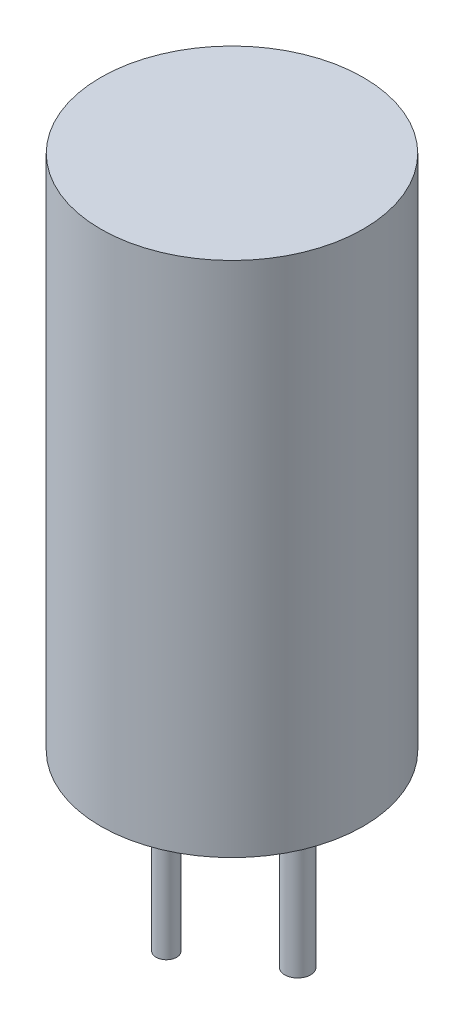
ISO-10303-21;
HEADER;
FILE_DESCRIPTION(('STEP AP214'),'2;1');
FILE_NAME('part.step','',(''),(''),'','','');
FILE_SCHEMA(('AUTOMOTIVE_DESIGN { 1 0 10303 214 1 1 1 1 }'));
ENDSEC;
DATA;
#1=APPLICATION_CONTEXT('core data for automotive mechanical design processes');
#2=APPLICATION_PROTOCOL_DEFINITION('international standard','automotive_design',2000,#1);
#3=PRODUCT_CONTEXT('',#1,'mechanical');
#4=PRODUCT('Part','Part','',(#3));
#5=PRODUCT_RELATED_PRODUCT_CATEGORY('part','',(#4));
#6=PRODUCT_DEFINITION_FORMATION('','',#4);
#7=PRODUCT_DEFINITION_CONTEXT('part definition',#1,'design');
#8=PRODUCT_DEFINITION('design','',#6,#7);
#9=PRODUCT_DEFINITION_SHAPE('','',#8);
#10=(LENGTH_UNIT() NAMED_UNIT(*) SI_UNIT(.MILLI.,.METRE.));
#11=(NAMED_UNIT(*) PLANE_ANGLE_UNIT() SI_UNIT($,.RADIAN.));
#12=(NAMED_UNIT(*) SI_UNIT($,.STERADIAN.) SOLID_ANGLE_UNIT());
#13=UNCERTAINTY_MEASURE_WITH_UNIT(LENGTH_MEASURE(1.E-05),#10,'distance_accuracy_value','');
#14=(GEOMETRIC_REPRESENTATION_CONTEXT(3) GLOBAL_UNCERTAINTY_ASSIGNED_CONTEXT((#13)) GLOBAL_UNIT_ASSIGNED_CONTEXT((#10,
#11,#12)) REPRESENTATION_CONTEXT('',''));
#15=CARTESIAN_POINT('',(0.,0.,0.));
#16=DIRECTION('',(0.,0.,1.));
#17=DIRECTION('',(1.,0.,0.));
#18=AXIS2_PLACEMENT_3D('',#15,#16,#17);
#19=CARTESIAN_POINT('',(0.,0.,0.));
#20=DIRECTION('',(0.,1.,0.));
#21=DIRECTION('',(0.,0.,1.));
#22=AXIS2_PLACEMENT_3D('',#19,#20,#21);
#23=PLANE('',#22);
#24=CARTESIAN_POINT('',(-2.54,0.,0.));
#25=DIRECTION('',(0.,1.,0.));
#26=DIRECTION('',(0.,0.,1.));
#27=AXIS2_PLACEMENT_3D('',#24,#25,#26);
#28=CIRCLE('',#27,0.4);
#29=CARTESIAN_POINT('',(-2.54,0.,0.4));
#30=VERTEX_POINT('',#29);
#31=EDGE_CURVE('E38',#30,#30,#28,.F.);
#32=ORIENTED_EDGE('',*,*,#31,.F.);
#33=EDGE_LOOP('',(#32));
#34=FACE_BOUND('',#33,.T.);
#35=CARTESIAN_POINT('',(0.,0.,0.));
#36=DIRECTION('',(0.,1.,0.));
#37=DIRECTION('',(0.,0.,1.));
#38=AXIS2_PLACEMENT_3D('',#35,#36,#37);
#39=CIRCLE('',#38,5.08);
#40=CARTESIAN_POINT('',(0.,0.,5.08));
#41=VERTEX_POINT('',#40);
#42=EDGE_CURVE('E46',#41,#41,#39,.T.);
#43=ORIENTED_EDGE('',*,*,#42,.F.);
#44=EDGE_LOOP('',(#43));
#45=FACE_BOUND('',#44,.T.);
#46=CARTESIAN_POINT('',(2.54,0.,0.));
#47=DIRECTION('',(0.,1.,0.));
#48=DIRECTION('',(0.,0.,1.));
#49=AXIS2_PLACEMENT_3D('',#46,#47,#48);
#50=CIRCLE('',#49,0.500000000000001);
#51=CARTESIAN_POINT('',(2.54,0.,0.5));
#52=VERTEX_POINT('',#51);
#53=EDGE_CURVE('E10',#52,#52,#50,.F.);
#54=ORIENTED_EDGE('',*,*,#53,.F.);
#55=EDGE_LOOP('',(#54));
#56=FACE_BOUND('',#55,.T.);
#57=ADVANCED_FACE('F31',(#34,#45,#56),#23,.F.);
#58=CARTESIAN_POINT('',(0.,20.,0.));
#59=DIRECTION('',(0.,-1.,0.));
#60=DIRECTION('',(0.,0.,-1.));
#61=AXIS2_PLACEMENT_3D('',#58,#59,#60);
#62=CYLINDRICAL_SURFACE('',#61,5.08);
#63=CARTESIAN_POINT('',(0.,20.,0.));
#64=DIRECTION('',(0.,1.,0.));
#65=DIRECTION('',(0.,0.,1.));
#66=AXIS2_PLACEMENT_3D('',#63,#64,#65);
#67=CIRCLE('',#66,5.08);
#68=CARTESIAN_POINT('',(0.,20.,5.08));
#69=VERTEX_POINT('',#68);
#70=EDGE_CURVE('E42',#69,#69,#67,.T.);
#71=ORIENTED_EDGE('',*,*,#70,.F.);
#72=EDGE_LOOP('',(#71));
#73=FACE_BOUND('',#72,.T.);
#74=ORIENTED_EDGE('',*,*,#42,.T.);
#75=EDGE_LOOP('',(#74));
#76=FACE_BOUND('',#75,.T.);
#77=ADVANCED_FACE('F33',(#73,#76),#62,.T.);
#78=CARTESIAN_POINT('',(0.,20.,0.));
#79=DIRECTION('',(0.,1.,0.));
#80=DIRECTION('',(0.,0.,1.));
#81=AXIS2_PLACEMENT_3D('',#78,#79,#80);
#82=PLANE('',#81);
#83=ORIENTED_EDGE('',*,*,#70,.T.);
#84=EDGE_LOOP('',(#83));
#85=FACE_BOUND('',#84,.T.);
#86=ADVANCED_FACE('F77',(#85),#82,.T.);
#87=CARTESIAN_POINT('',(-2.54,-8.,0.));
#88=DIRECTION('',(0.,1.,0.));
#89=DIRECTION('',(0.,0.,1.));
#90=AXIS2_PLACEMENT_3D('',#87,#88,#89);
#91=CYLINDRICAL_SURFACE('',#90,0.4);
#92=CARTESIAN_POINT('',(-2.54,-8.,0.));
#93=DIRECTION('',(0.,-1.,0.));
#94=DIRECTION('',(0.,0.,-1.));
#95=AXIS2_PLACEMENT_3D('',#92,#93,#94);
#96=CIRCLE('',#95,0.4);
#97=CARTESIAN_POINT('',(-2.54,-8.,-0.4));
#98=VERTEX_POINT('',#97);
#99=EDGE_CURVE('E50',#98,#98,#96,.T.);
#100=ORIENTED_EDGE('',*,*,#99,.F.);
#101=EDGE_LOOP('',(#100));
#102=FACE_BOUND('',#101,.T.);
#103=ORIENTED_EDGE('',*,*,#31,.T.);
#104=EDGE_LOOP('',(#103));
#105=FACE_BOUND('',#104,.T.);
#106=ADVANCED_FACE('F69',(#102,#105),#91,.T.);
#107=CARTESIAN_POINT('',(-2.54,-8.,0.));
#108=DIRECTION('',(0.,-1.,0.));
#109=DIRECTION('',(0.,0.,-1.));
#110=AXIS2_PLACEMENT_3D('',#107,#108,#109);
#111=PLANE('',#110);
#112=ORIENTED_EDGE('',*,*,#99,.T.);
#113=EDGE_LOOP('',(#112));
#114=FACE_BOUND('',#113,.T.);
#115=ADVANCED_FACE('F62',(#114),#111,.T.);
#116=CARTESIAN_POINT('',(2.54,-6.,0.));
#117=DIRECTION('',(0.,1.,0.));
#118=DIRECTION('',(0.,0.,1.));
#119=AXIS2_PLACEMENT_3D('',#116,#117,#118);
#120=CYLINDRICAL_SURFACE('',#119,0.500000000000001);
#121=CARTESIAN_POINT('',(2.54,-6.,0.));
#122=DIRECTION('',(0.,-1.,0.));
#123=DIRECTION('',(0.,0.,-1.));
#124=AXIS2_PLACEMENT_3D('',#121,#122,#123);
#125=CIRCLE('',#124,0.500000000000001);
#126=CARTESIAN_POINT('',(2.54,-6.,-0.500000000000001));
#127=VERTEX_POINT('',#126);
#128=EDGE_CURVE('E54',#127,#127,#125,.T.);
#129=ORIENTED_EDGE('',*,*,#128,.F.);
#130=EDGE_LOOP('',(#129));
#131=FACE_BOUND('',#130,.T.);
#132=ORIENTED_EDGE('',*,*,#53,.T.);
#133=EDGE_LOOP('',(#132));
#134=FACE_BOUND('',#133,.T.);
#135=ADVANCED_FACE('F60',(#131,#134),#120,.T.);
#136=CARTESIAN_POINT('',(2.54,-6.,0.));
#137=DIRECTION('',(0.,-1.,0.));
#138=DIRECTION('',(0.,0.,-1.));
#139=AXIS2_PLACEMENT_3D('',#136,#137,#138);
#140=PLANE('',#139);
#141=ORIENTED_EDGE('',*,*,#128,.T.);
#142=EDGE_LOOP('',(#141));
#143=FACE_BOUND('',#142,.T.);
#144=ADVANCED_FACE('F58',(#143),#140,.T.);
#145=CLOSED_SHELL('',(#57,#77,#86,#106,#115,#135,#144));
#146=MANIFOLD_SOLID_BREP('B2',#145);
#147=ADVANCED_BREP_SHAPE_REPRESENTATION('',(#18,#146),#14);
#148=SHAPE_DEFINITION_REPRESENTATION(#9,#147);
ENDSEC;
END-ISO-10303-21;
